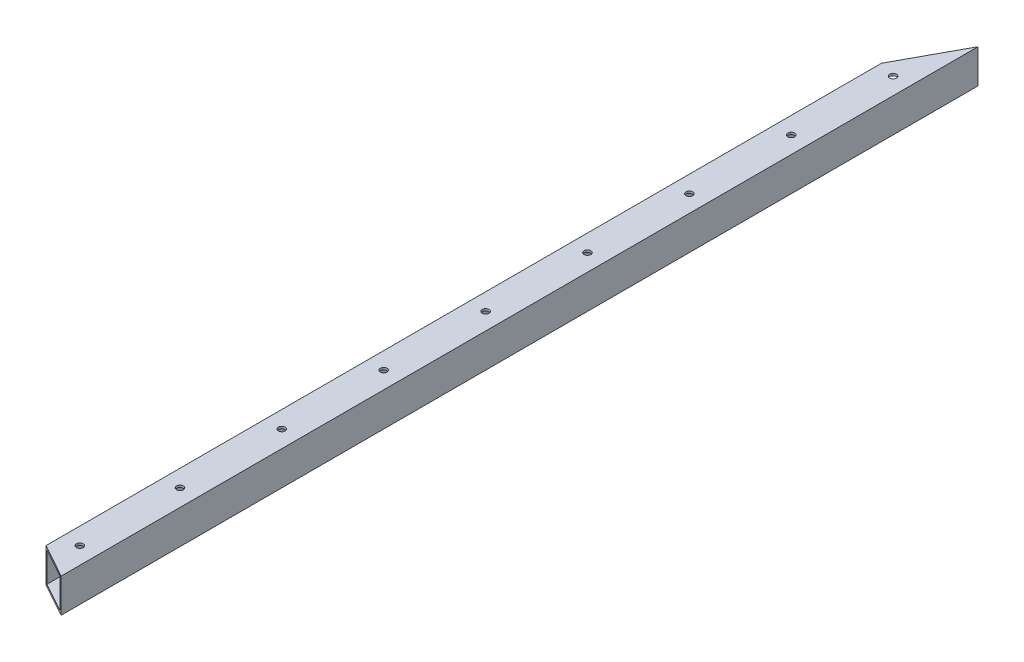
ISO-10303-21;
HEADER;
FILE_DESCRIPTION(('STEP AP214'),'2;1');
FILE_NAME('part.step','',(''),(''),'','','');
FILE_SCHEMA(('AUTOMOTIVE_DESIGN { 1 0 10303 214 1 1 1 1 }'));
ENDSEC;
DATA;
#1=APPLICATION_CONTEXT('core data for automotive mechanical design processes');
#2=APPLICATION_PROTOCOL_DEFINITION('international standard','automotive_design',2000,#1);
#3=PRODUCT_CONTEXT('',#1,'mechanical');
#4=PRODUCT('Part','Part','',(#3));
#5=PRODUCT_RELATED_PRODUCT_CATEGORY('part','',(#4));
#6=PRODUCT_DEFINITION_FORMATION('','',#4);
#7=PRODUCT_DEFINITION_CONTEXT('part definition',#1,'design');
#8=PRODUCT_DEFINITION('design','',#6,#7);
#9=PRODUCT_DEFINITION_SHAPE('','',#8);
#10=(LENGTH_UNIT() NAMED_UNIT(*) SI_UNIT(.MILLI.,.METRE.));
#11=(NAMED_UNIT(*) PLANE_ANGLE_UNIT() SI_UNIT($,.RADIAN.));
#12=(NAMED_UNIT(*) SI_UNIT($,.STERADIAN.) SOLID_ANGLE_UNIT());
#13=UNCERTAINTY_MEASURE_WITH_UNIT(LENGTH_MEASURE(1.E-05),#10,'distance_accuracy_value','');
#14=(GEOMETRIC_REPRESENTATION_CONTEXT(3) GLOBAL_UNCERTAINTY_ASSIGNED_CONTEXT((#13)) GLOBAL_UNIT_ASSIGNED_CONTEXT((#10,
#11,#12)) REPRESENTATION_CONTEXT('',''));
#15=CARTESIAN_POINT('',(0.,0.,0.));
#16=DIRECTION('',(0.,0.,1.));
#17=DIRECTION('',(1.,0.,0.));
#18=AXIS2_PLACEMENT_3D('',#15,#16,#17);
#19=CARTESIAN_POINT('',(1.5875,23.8125,685.8));
#20=DIRECTION('',(0.,-1.,0.));
#21=DIRECTION('',(0.,0.,-1.));
#22=AXIS2_PLACEMENT_3D('',#19,#20,#21);
#23=PLANE('',#22);
#24=CARTESIAN_POINT('',(12.7,23.8125,431.8));
#25=DIRECTION('',(0.,-1.,0.));
#26=DIRECTION('',(0.,0.,-1.));
#27=AXIS2_PLACEMENT_3D('',#24,#25,#26);
#28=CIRCLE('',#27,2.54);
#29=CARTESIAN_POINT('',(12.7,23.8125,429.26));
#30=VERTEX_POINT('',#29);
#31=EDGE_CURVE('E43',#30,#30,#28,.T.);
#32=ORIENTED_EDGE('',*,*,#31,.F.);
#33=EDGE_LOOP('',(#32));
#34=FACE_BOUND('',#33,.T.);
#35=CARTESIAN_POINT('',(12.7,23.8125,355.6));
#36=DIRECTION('',(0.,-1.,0.));
#37=DIRECTION('',(0.,0.,-1.));
#38=AXIS2_PLACEMENT_3D('',#35,#36,#37);
#39=CIRCLE('',#38,2.54);
#40=CARTESIAN_POINT('',(12.7,23.8125,353.06));
#41=VERTEX_POINT('',#40);
#42=EDGE_CURVE('E174',#41,#41,#39,.T.);
#43=ORIENTED_EDGE('',*,*,#42,.F.);
#44=EDGE_LOOP('',(#43));
#45=FACE_BOUND('',#44,.T.);
#46=CARTESIAN_POINT('',(12.7,23.8125,279.4));
#47=DIRECTION('',(0.,-1.,0.));
#48=DIRECTION('',(0.,0.,-1.));
#49=AXIS2_PLACEMENT_3D('',#46,#47,#48);
#50=CIRCLE('',#49,2.54);
#51=CARTESIAN_POINT('',(12.7,23.8125,276.86));
#52=VERTEX_POINT('',#51);
#53=EDGE_CURVE('E170',#52,#52,#50,.T.);
#54=ORIENTED_EDGE('',*,*,#53,.F.);
#55=EDGE_LOOP('',(#54));
#56=FACE_BOUND('',#55,.T.);
#57=CARTESIAN_POINT('',(12.7,23.8125,203.2));
#58=DIRECTION('',(0.,-1.,0.));
#59=DIRECTION('',(0.,0.,-1.));
#60=AXIS2_PLACEMENT_3D('',#57,#58,#59);
#61=CIRCLE('',#60,2.54);
#62=CARTESIAN_POINT('',(12.7,23.8125,200.66));
#63=VERTEX_POINT('',#62);
#64=EDGE_CURVE('E165',#63,#63,#61,.T.);
#65=ORIENTED_EDGE('',*,*,#64,.F.);
#66=EDGE_LOOP('',(#65));
#67=FACE_BOUND('',#66,.T.);
#68=CARTESIAN_POINT('',(12.7,23.8125,50.8));
#69=DIRECTION('',(0.,-1.,0.));
#70=DIRECTION('',(0.,0.,-1.));
#71=AXIS2_PLACEMENT_3D('',#68,#69,#70);
#72=CIRCLE('',#71,2.54);
#73=CARTESIAN_POINT('',(12.7,23.8125,48.26));
#74=VERTEX_POINT('',#73);
#75=EDGE_CURVE('E160',#74,#74,#72,.T.);
#76=ORIENTED_EDGE('',*,*,#75,.F.);
#77=EDGE_LOOP('',(#76));
#78=FACE_BOUND('',#77,.T.);
#79=CARTESIAN_POINT('',(12.7,23.8125,127.));
#80=DIRECTION('',(0.,-1.,0.));
#81=DIRECTION('',(0.,0.,-1.));
#82=AXIS2_PLACEMENT_3D('',#79,#80,#81);
#83=CIRCLE('',#82,2.54);
#84=CARTESIAN_POINT('',(12.7,23.8125,124.46));
#85=VERTEX_POINT('',#84);
#86=EDGE_CURVE('E154',#85,#85,#83,.T.);
#87=ORIENTED_EDGE('',*,*,#86,.F.);
#88=EDGE_LOOP('',(#87));
#89=FACE_BOUND('',#88,.T.);
#90=DIRECTION('',(-0.477158760259603,0.,0.878817112661968));
#91=VECTOR('',#90,1.);
#92=CARTESIAN_POINT('',(-267.601779237836,23.8125,539.642146556257));
#93=LINE('',#92,#91);
#94=CARTESIAN_POINT('',(23.8125,23.8125,2.9238112815782));
#95=VERTEX_POINT('',#94);
#96=CARTESIAN_POINT('',(1.58749999999996,23.8125,43.8571692236724));
#97=VERTEX_POINT('',#96);
#98=EDGE_CURVE('E11',#95,#97,#93,.T.);
#99=ORIENTED_EDGE('',*,*,#98,.F.);
#100=DIRECTION('',(0.,0.,-1.));
#101=VECTOR('',#100,1.);
#102=CARTESIAN_POINT('',(23.8125,23.8125,685.8));
#103=LINE('',#102,#101);
#104=CARTESIAN_POINT('',(23.8125,23.8125,684.920034380819));
#105=VERTEX_POINT('',#104);
#106=EDGE_CURVE('E199',#105,#95,#103,.T.);
#107=ORIENTED_EDGE('',*,*,#106,.F.);
#108=DIRECTION('',(0.874619707139394,0.,0.484809620246341));
#109=VECTOR('',#108,1.);
#110=CARTESIAN_POINT('',(7.18439876022348,23.8125,675.702927355137));
#111=LINE('',#110,#109);
#112=CARTESIAN_POINT('',(1.58749999999999,23.8125,672.600515712281));
#113=VERTEX_POINT('',#112);
#114=EDGE_CURVE('E49',#113,#105,#111,.T.);
#115=ORIENTED_EDGE('',*,*,#114,.F.);
#116=DIRECTION('',(0.,0.,-1.));
#117=VECTOR('',#116,1.);
#118=CARTESIAN_POINT('',(1.5875,23.8125,685.8));
#119=LINE('',#118,#117);
#120=EDGE_CURVE('E195',#113,#97,#119,.T.);
#121=ORIENTED_EDGE('',*,*,#120,.T.);
#122=EDGE_LOOP('',(#99,#107,#115,#121));
#123=FACE_BOUND('',#122,.T.);
#124=CARTESIAN_POINT('',(12.7,23.8125,508.));
#125=DIRECTION('',(0.,-1.,0.));
#126=DIRECTION('',(0.,0.,-1.));
#127=AXIS2_PLACEMENT_3D('',#124,#125,#126);
#128=CIRCLE('',#127,2.53999999999999);
#129=CARTESIAN_POINT('',(12.7,23.8125,505.46));
#130=VERTEX_POINT('',#129);
#131=EDGE_CURVE('E149',#130,#130,#128,.T.);
#132=ORIENTED_EDGE('',*,*,#131,.F.);
#133=EDGE_LOOP('',(#132));
#134=FACE_BOUND('',#133,.T.);
#135=CARTESIAN_POINT('',(12.7,23.8125,584.2));
#136=DIRECTION('',(0.,-1.,0.));
#137=DIRECTION('',(0.,0.,-1.));
#138=AXIS2_PLACEMENT_3D('',#135,#136,#137);
#139=CIRCLE('',#138,2.53999999999999);
#140=CARTESIAN_POINT('',(12.7,23.8125,581.66));
#141=VERTEX_POINT('',#140);
#142=EDGE_CURVE('E144',#141,#141,#139,.T.);
#143=ORIENTED_EDGE('',*,*,#142,.F.);
#144=EDGE_LOOP('',(#143));
#145=FACE_BOUND('',#144,.T.);
#146=CARTESIAN_POINT('',(12.7,23.8125,659.13));
#147=DIRECTION('',(0.,-1.,0.));
#148=DIRECTION('',(0.,0.,-1.));
#149=AXIS2_PLACEMENT_3D('',#146,#147,#148);
#150=CIRCLE('',#149,2.53999999999994);
#151=CARTESIAN_POINT('',(12.7,23.8125,656.59));
#152=VERTEX_POINT('',#151);
#153=EDGE_CURVE('E138',#152,#152,#150,.T.);
#154=ORIENTED_EDGE('',*,*,#153,.F.);
#155=EDGE_LOOP('',(#154));
#156=FACE_BOUND('',#155,.T.);
#157=ADVANCED_FACE('F39',(#34,#45,#56,#67,#78,#89,#123,#134,#145,#156),#23,.T.);
#158=CARTESIAN_POINT('',(23.8125,1.5875,685.8));
#159=DIRECTION('',(-1.,0.,0.));
#160=DIRECTION('',(0.,0.,1.));
#161=AXIS2_PLACEMENT_3D('',#158,#159,#160);
#162=PLANE('',#161);
#163=DIRECTION('',(0.,1.,0.));
#164=VECTOR('',#163,1.);
#165=CARTESIAN_POINT('',(23.8125,1.5875,2.92381128157815));
#166=LINE('',#165,#164);
#167=CARTESIAN_POINT('',(23.8125,1.5875,2.92381128157815));
#168=VERTEX_POINT('',#167);
#169=EDGE_CURVE('E278',#168,#95,#166,.T.);
#170=ORIENTED_EDGE('',*,*,#169,.F.);
#171=DIRECTION('',(0.,0.,-1.));
#172=VECTOR('',#171,1.);
#173=CARTESIAN_POINT('',(23.8125,1.5875,685.8));
#174=LINE('',#173,#172);
#175=CARTESIAN_POINT('',(23.8125,1.5875,684.920034380819));
#176=VERTEX_POINT('',#175);
#177=EDGE_CURVE('E203',#176,#168,#174,.T.);
#178=ORIENTED_EDGE('',*,*,#177,.F.);
#179=DIRECTION('',(0.,-1.,0.));
#180=VECTOR('',#179,1.);
#181=CARTESIAN_POINT('',(23.8125,1.5875,684.920034380819));
#182=LINE('',#181,#180);
#183=EDGE_CURVE('E270',#105,#176,#182,.T.);
#184=ORIENTED_EDGE('',*,*,#183,.F.);
#185=ORIENTED_EDGE('',*,*,#106,.T.);
#186=EDGE_LOOP('',(#170,#178,#184,#185));
#187=FACE_BOUND('',#186,.T.);
#188=ADVANCED_FACE('F299',(#187),#162,.T.);
#189=CARTESIAN_POINT('',(1.5875,1.5875,685.8));
#190=DIRECTION('',(0.,1.,0.));
#191=DIRECTION('',(0.,0.,1.));
#192=AXIS2_PLACEMENT_3D('',#189,#190,#191);
#193=PLANE('',#192);
#194=CARTESIAN_POINT('',(12.7,1.5875,431.8));
#195=DIRECTION('',(0.,1.,0.));
#196=DIRECTION('',(0.,0.,1.));
#197=AXIS2_PLACEMENT_3D('',#194,#195,#196);
#198=CIRCLE('',#197,2.54);
#199=CARTESIAN_POINT('',(12.7,1.5875,434.34));
#200=VERTEX_POINT('',#199);
#201=EDGE_CURVE('E191',#200,#200,#198,.T.);
#202=ORIENTED_EDGE('',*,*,#201,.F.);
#203=EDGE_LOOP('',(#202));
#204=FACE_BOUND('',#203,.T.);
#205=CARTESIAN_POINT('',(12.7,1.5875,355.6));
#206=DIRECTION('',(0.,1.,0.));
#207=DIRECTION('',(0.,0.,1.));
#208=AXIS2_PLACEMENT_3D('',#205,#206,#207);
#209=CIRCLE('',#208,2.54);
#210=CARTESIAN_POINT('',(12.7,1.5875,358.14));
#211=VERTEX_POINT('',#210);
#212=EDGE_CURVE('E177',#211,#211,#209,.T.);
#213=ORIENTED_EDGE('',*,*,#212,.F.);
#214=EDGE_LOOP('',(#213));
#215=FACE_BOUND('',#214,.T.);
#216=CARTESIAN_POINT('',(12.7,1.5875,279.4));
#217=DIRECTION('',(0.,1.,0.));
#218=DIRECTION('',(0.,0.,1.));
#219=AXIS2_PLACEMENT_3D('',#216,#217,#218);
#220=CIRCLE('',#219,2.54);
#221=CARTESIAN_POINT('',(12.7,1.5875,281.94));
#222=VERTEX_POINT('',#221);
#223=EDGE_CURVE('E173',#222,#222,#220,.T.);
#224=ORIENTED_EDGE('',*,*,#223,.F.);
#225=EDGE_LOOP('',(#224));
#226=FACE_BOUND('',#225,.T.);
#227=CARTESIAN_POINT('',(12.7,1.5875,203.2));
#228=DIRECTION('',(0.,1.,0.));
#229=DIRECTION('',(0.,0.,1.));
#230=AXIS2_PLACEMENT_3D('',#227,#228,#229);
#231=CIRCLE('',#230,2.54);
#232=CARTESIAN_POINT('',(12.7,1.5875,205.74));
#233=VERTEX_POINT('',#232);
#234=EDGE_CURVE('E169',#233,#233,#231,.T.);
#235=ORIENTED_EDGE('',*,*,#234,.F.);
#236=EDGE_LOOP('',(#235));
#237=FACE_BOUND('',#236,.T.);
#238=CARTESIAN_POINT('',(12.7,1.5875,50.8));
#239=DIRECTION('',(0.,1.,0.));
#240=DIRECTION('',(0.,0.,1.));
#241=AXIS2_PLACEMENT_3D('',#238,#239,#240);
#242=CIRCLE('',#241,2.54);
#243=CARTESIAN_POINT('',(12.7,1.5875,53.34));
#244=VERTEX_POINT('',#243);
#245=EDGE_CURVE('E164',#244,#244,#242,.T.);
#246=ORIENTED_EDGE('',*,*,#245,.F.);
#247=EDGE_LOOP('',(#246));
#248=FACE_BOUND('',#247,.T.);
#249=CARTESIAN_POINT('',(12.7,1.5875,127.));
#250=DIRECTION('',(0.,1.,0.));
#251=DIRECTION('',(0.,0.,1.));
#252=AXIS2_PLACEMENT_3D('',#249,#250,#251);
#253=CIRCLE('',#252,2.54);
#254=CARTESIAN_POINT('',(12.7,1.5875,129.54));
#255=VERTEX_POINT('',#254);
#256=EDGE_CURVE('E158',#255,#255,#253,.T.);
#257=ORIENTED_EDGE('',*,*,#256,.F.);
#258=EDGE_LOOP('',(#257));
#259=FACE_BOUND('',#258,.T.);
#260=DIRECTION('',(0.477158760259603,0.,-0.878817112661968));
#261=VECTOR('',#260,1.);
#262=CARTESIAN_POINT('',(-267.601779237836,1.5875,539.642146556257));
#263=LINE('',#262,#261);
#264=CARTESIAN_POINT('',(1.58749999999996,1.5875,43.8571692236724));
#265=VERTEX_POINT('',#264);
#266=EDGE_CURVE('E281',#265,#168,#263,.T.);
#267=ORIENTED_EDGE('',*,*,#266,.F.);
#268=DIRECTION('',(0.,0.,-1.));
#269=VECTOR('',#268,1.);
#270=CARTESIAN_POINT('',(1.5875,1.5875,685.8));
#271=LINE('',#270,#269);
#272=CARTESIAN_POINT('',(1.5875,1.5875,672.600515712281));
#273=VERTEX_POINT('',#272);
#274=EDGE_CURVE('E207',#273,#265,#271,.T.);
#275=ORIENTED_EDGE('',*,*,#274,.F.);
#276=DIRECTION('',(-0.874619707139394,0.,-0.484809620246341));
#277=VECTOR('',#276,1.);
#278=CARTESIAN_POINT('',(7.18439876022348,1.5875,675.702927355137));
#279=LINE('',#278,#277);
#280=EDGE_CURVE('E273',#176,#273,#279,.T.);
#281=ORIENTED_EDGE('',*,*,#280,.F.);
#282=ORIENTED_EDGE('',*,*,#177,.T.);
#283=EDGE_LOOP('',(#267,#275,#281,#282));
#284=FACE_BOUND('',#283,.T.);
#285=CARTESIAN_POINT('',(12.7,1.5875,508.));
#286=DIRECTION('',(0.,1.,0.));
#287=DIRECTION('',(0.,0.,1.));
#288=AXIS2_PLACEMENT_3D('',#285,#286,#287);
#289=CIRCLE('',#288,2.53999999999999);
#290=CARTESIAN_POINT('',(12.7,1.5875,510.54));
#291=VERTEX_POINT('',#290);
#292=EDGE_CURVE('E152',#291,#291,#289,.T.);
#293=ORIENTED_EDGE('',*,*,#292,.F.);
#294=EDGE_LOOP('',(#293));
#295=FACE_BOUND('',#294,.T.);
#296=CARTESIAN_POINT('',(12.7,1.5875,584.2));
#297=DIRECTION('',(0.,1.,0.));
#298=DIRECTION('',(0.,0.,1.));
#299=AXIS2_PLACEMENT_3D('',#296,#297,#298);
#300=CIRCLE('',#299,2.53999999999999);
#301=CARTESIAN_POINT('',(12.7,1.5875,586.74));
#302=VERTEX_POINT('',#301);
#303=EDGE_CURVE('E148',#302,#302,#300,.T.);
#304=ORIENTED_EDGE('',*,*,#303,.F.);
#305=EDGE_LOOP('',(#304));
#306=FACE_BOUND('',#305,.T.);
#307=CARTESIAN_POINT('',(12.7,1.5875,659.13));
#308=DIRECTION('',(0.,1.,0.));
#309=DIRECTION('',(0.,0.,1.));
#310=AXIS2_PLACEMENT_3D('',#307,#308,#309);
#311=CIRCLE('',#310,2.53999999999994);
#312=CARTESIAN_POINT('',(12.7,1.5875,661.67));
#313=VERTEX_POINT('',#312);
#314=EDGE_CURVE('E142',#313,#313,#311,.T.);
#315=ORIENTED_EDGE('',*,*,#314,.F.);
#316=EDGE_LOOP('',(#315));
#317=FACE_BOUND('',#316,.T.);
#318=ADVANCED_FACE('F295',(#204,#215,#226,#237,#248,#259,#284,#295,#306,#317),#193,.T.);
#319=CARTESIAN_POINT('',(1.5875,1.5875,685.8));
#320=DIRECTION('',(1.,0.,0.));
#321=DIRECTION('',(0.,0.,-1.));
#322=AXIS2_PLACEMENT_3D('',#319,#320,#321);
#323=PLANE('',#322);
#324=DIRECTION('',(0.,-1.,0.));
#325=VECTOR('',#324,1.);
#326=CARTESIAN_POINT('',(1.5875,1.5875,43.8571692236723));
#327=LINE('',#326,#325);
#328=EDGE_CURVE('E159',#97,#265,#327,.T.);
#329=ORIENTED_EDGE('',*,*,#328,.F.);
#330=ORIENTED_EDGE('',*,*,#120,.F.);
#331=DIRECTION('',(0.,1.,0.));
#332=VECTOR('',#331,1.);
#333=CARTESIAN_POINT('',(1.5875,1.5875,672.600515712281));
#334=LINE('',#333,#332);
#335=EDGE_CURVE('E65',#273,#113,#334,.T.);
#336=ORIENTED_EDGE('',*,*,#335,.F.);
#337=ORIENTED_EDGE('',*,*,#274,.T.);
#338=EDGE_LOOP('',(#329,#330,#336,#337));
#339=FACE_BOUND('',#338,.T.);
#340=ADVANCED_FACE('F298',(#339),#323,.T.);
#341=CARTESIAN_POINT('',(12.7,0.,659.13));
#342=DIRECTION('',(0.,1.,0.));
#343=DIRECTION('',(0.,0.,1.));
#344=AXIS2_PLACEMENT_3D('',#341,#342,#343);
#345=CYLINDRICAL_SURFACE('',#344,2.53999999999994);
#346=ORIENTED_EDGE('',*,*,#153,.T.);
#347=EDGE_LOOP('',(#346));
#348=FACE_BOUND('',#347,.T.);
#349=CARTESIAN_POINT('',(12.7,25.4,659.13));
#350=DIRECTION('',(0.,1.,0.));
#351=DIRECTION('',(0.,0.,1.));
#352=AXIS2_PLACEMENT_3D('',#349,#350,#351);
#353=CIRCLE('',#352,2.53999999999994);
#354=CARTESIAN_POINT('',(12.7,25.4,661.67));
#355=VERTEX_POINT('',#354);
#356=EDGE_CURVE('E243',#355,#355,#353,.T.);
#357=ORIENTED_EDGE('',*,*,#356,.T.);
#358=EDGE_LOOP('',(#357));
#359=FACE_BOUND('',#358,.T.);
#360=ADVANCED_FACE('F319',(#348,#359),#345,.F.);
#361=CARTESIAN_POINT('',(12.7,0.,584.2));
#362=DIRECTION('',(0.,1.,0.));
#363=DIRECTION('',(0.,0.,1.));
#364=AXIS2_PLACEMENT_3D('',#361,#362,#363);
#365=CYLINDRICAL_SURFACE('',#364,2.53999999999999);
#366=ORIENTED_EDGE('',*,*,#142,.T.);
#367=EDGE_LOOP('',(#366));
#368=FACE_BOUND('',#367,.T.);
#369=CARTESIAN_POINT('',(12.7,25.4,584.2));
#370=DIRECTION('',(0.,1.,0.));
#371=DIRECTION('',(0.,0.,1.));
#372=AXIS2_PLACEMENT_3D('',#369,#370,#371);
#373=CIRCLE('',#372,2.53999999999999);
#374=CARTESIAN_POINT('',(12.7,25.4,586.74));
#375=VERTEX_POINT('',#374);
#376=EDGE_CURVE('E378',#375,#375,#373,.T.);
#377=ORIENTED_EDGE('',*,*,#376,.T.);
#378=EDGE_LOOP('',(#377));
#379=FACE_BOUND('',#378,.T.);
#380=ADVANCED_FACE('F382',(#368,#379),#365,.F.);
#381=CARTESIAN_POINT('',(12.7,0.,508.));
#382=DIRECTION('',(0.,1.,0.));
#383=DIRECTION('',(0.,0.,1.));
#384=AXIS2_PLACEMENT_3D('',#381,#382,#383);
#385=CYLINDRICAL_SURFACE('',#384,2.53999999999999);
#386=ORIENTED_EDGE('',*,*,#131,.T.);
#387=EDGE_LOOP('',(#386));
#388=FACE_BOUND('',#387,.T.);
#389=CARTESIAN_POINT('',(12.7,25.4,508.));
#390=DIRECTION('',(0.,1.,0.));
#391=DIRECTION('',(0.,0.,1.));
#392=AXIS2_PLACEMENT_3D('',#389,#390,#391);
#393=CIRCLE('',#392,2.53999999999999);
#394=CARTESIAN_POINT('',(12.7,25.4,510.54));
#395=VERTEX_POINT('',#394);
#396=EDGE_CURVE('E374',#395,#395,#393,.T.);
#397=ORIENTED_EDGE('',*,*,#396,.T.);
#398=EDGE_LOOP('',(#397));
#399=FACE_BOUND('',#398,.T.);
#400=ADVANCED_FACE('F387',(#388,#399),#385,.F.);
#401=CARTESIAN_POINT('',(0.,0.,671.7205500931));
#402=DIRECTION('',(0.484809620246341,0.,-0.874619707139394));
#403=DIRECTION('',(-0.874619707139394,0.,-0.484809620246341));
#404=AXIS2_PLACEMENT_3D('',#401,#402,#403);
#405=PLANE('',#404);
#406=ORIENTED_EDGE('',*,*,#335,.T.);
#407=ORIENTED_EDGE('',*,*,#114,.T.);
#408=ORIENTED_EDGE('',*,*,#183,.T.);
#409=ORIENTED_EDGE('',*,*,#280,.T.);
#410=EDGE_LOOP('',(#406,#407,#408,#409));
#411=FACE_BOUND('',#410,.T.);
#412=DIRECTION('',(-0.874619707139394,0.,-0.484809620246341));
#413=VECTOR('',#412,1.);
#414=CARTESIAN_POINT('',(0.,25.4,671.7205500931));
#415=LINE('',#414,#413);
#416=CARTESIAN_POINT('',(25.4,25.4,685.8));
#417=VERTEX_POINT('',#416);
#418=CARTESIAN_POINT('',(0.,25.4,671.7205500931));
#419=VERTEX_POINT('',#418);
#420=EDGE_CURVE('E223',#417,#419,#415,.T.);
#421=ORIENTED_EDGE('',*,*,#420,.T.);
#422=DIRECTION('',(0.,1.,0.));
#423=VECTOR('',#422,1.);
#424=CARTESIAN_POINT('',(0.,0.,671.7205500931));
#425=LINE('',#424,#423);
#426=CARTESIAN_POINT('',(0.,0.,671.7205500931));
#427=VERTEX_POINT('',#426);
#428=EDGE_CURVE('E229',#427,#419,#425,.T.);
#429=ORIENTED_EDGE('',*,*,#428,.F.);
#430=DIRECTION('',(-0.874619707139394,0.,-0.484809620246341));
#431=VECTOR('',#430,1.);
#432=CARTESIAN_POINT('',(0.,0.,671.7205500931));
#433=LINE('',#432,#431);
#434=CARTESIAN_POINT('',(25.4,0.,685.8));
#435=VERTEX_POINT('',#434);
#436=EDGE_CURVE('E127',#435,#427,#433,.T.);
#437=ORIENTED_EDGE('',*,*,#436,.F.);
#438=DIRECTION('',(0.,1.,0.));
#439=VECTOR('',#438,1.);
#440=CARTESIAN_POINT('',(25.4,0.,685.8));
#441=LINE('',#440,#439);
#442=EDGE_CURVE('E211',#435,#417,#441,.T.);
#443=ORIENTED_EDGE('',*,*,#442,.T.);
#444=EDGE_LOOP('',(#421,#429,#437,#443));
#445=FACE_BOUND('',#444,.T.);
#446=ADVANCED_FACE('F228',(#411,#445),#405,.F.);
#447=CARTESIAN_POINT('',(0.,0.,46.7809805052505));
#448=DIRECTION('',(0.878817112661968,0.,0.477158760259603));
#449=DIRECTION('',(0.477158760259603,0.,-0.878817112661968));
#450=AXIS2_PLACEMENT_3D('',#447,#448,#449);
#451=PLANE('',#450);
#452=ORIENTED_EDGE('',*,*,#328,.T.);
#453=ORIENTED_EDGE('',*,*,#266,.T.);
#454=ORIENTED_EDGE('',*,*,#169,.T.);
#455=ORIENTED_EDGE('',*,*,#98,.T.);
#456=EDGE_LOOP('',(#452,#453,#454,#455));
#457=FACE_BOUND('',#456,.T.);
#458=DIRECTION('',(0.477158760259603,0.,-0.878817112661968));
#459=VECTOR('',#458,1.);
#460=CARTESIAN_POINT('',(0.,25.4,46.7809805052505));
#461=LINE('',#460,#459);
#462=CARTESIAN_POINT('',(0.,25.4,46.7809805052505));
#463=VERTEX_POINT('',#462);
#464=CARTESIAN_POINT('',(25.4,25.4,0.));
#465=VERTEX_POINT('',#464);
#466=EDGE_CURVE('E113',#463,#465,#461,.T.);
#467=ORIENTED_EDGE('',*,*,#466,.T.);
#468=DIRECTION('',(0.,1.,0.));
#469=VECTOR('',#468,1.);
#470=CARTESIAN_POINT('',(25.4,0.,0.));
#471=LINE('',#470,#469);
#472=CARTESIAN_POINT('',(25.4,0.,0.));
#473=VERTEX_POINT('',#472);
#474=EDGE_CURVE('E107',#473,#465,#471,.T.);
#475=ORIENTED_EDGE('',*,*,#474,.F.);
#476=DIRECTION('',(0.477158760259603,0.,-0.878817112661968));
#477=VECTOR('',#476,1.);
#478=CARTESIAN_POINT('',(0.,0.,46.7809805052505));
#479=LINE('',#478,#477);
#480=CARTESIAN_POINT('',(0.,0.,46.7809805052505));
#481=VERTEX_POINT('',#480);
#482=EDGE_CURVE('E104',#481,#473,#479,.T.);
#483=ORIENTED_EDGE('',*,*,#482,.F.);
#484=DIRECTION('',(0.,1.,0.));
#485=VECTOR('',#484,1.);
#486=CARTESIAN_POINT('',(0.,0.,46.7809805052505));
#487=LINE('',#486,#485);
#488=EDGE_CURVE('E57',#481,#463,#487,.T.);
#489=ORIENTED_EDGE('',*,*,#488,.T.);
#490=EDGE_LOOP('',(#467,#475,#483,#489));
#491=FACE_BOUND('',#490,.T.);
#492=ADVANCED_FACE('F105',(#457,#491),#451,.F.);
#493=CARTESIAN_POINT('',(12.7,0.,127.));
#494=DIRECTION('',(0.,1.,0.));
#495=DIRECTION('',(0.,0.,1.));
#496=AXIS2_PLACEMENT_3D('',#493,#494,#495);
#497=CYLINDRICAL_SURFACE('',#496,2.54);
#498=ORIENTED_EDGE('',*,*,#86,.T.);
#499=EDGE_LOOP('',(#498));
#500=FACE_BOUND('',#499,.T.);
#501=CARTESIAN_POINT('',(12.7,25.4,127.));
#502=DIRECTION('',(0.,1.,0.));
#503=DIRECTION('',(0.,0.,1.));
#504=AXIS2_PLACEMENT_3D('',#501,#502,#503);
#505=CIRCLE('',#504,2.54);
#506=CARTESIAN_POINT('',(12.7,25.4,129.54));
#507=VERTEX_POINT('',#506);
#508=EDGE_CURVE('E123',#507,#507,#505,.T.);
#509=ORIENTED_EDGE('',*,*,#508,.T.);
#510=EDGE_LOOP('',(#509));
#511=FACE_BOUND('',#510,.T.);
#512=ADVANCED_FACE('F492',(#500,#511),#497,.F.);
#513=CARTESIAN_POINT('',(12.7,0.,50.8));
#514=DIRECTION('',(0.,1.,0.));
#515=DIRECTION('',(0.,0.,1.));
#516=AXIS2_PLACEMENT_3D('',#513,#514,#515);
#517=CYLINDRICAL_SURFACE('',#516,2.54);
#518=ORIENTED_EDGE('',*,*,#75,.T.);
#519=EDGE_LOOP('',(#518));
#520=FACE_BOUND('',#519,.T.);
#521=CARTESIAN_POINT('',(12.7,25.4,50.8));
#522=DIRECTION('',(0.,1.,0.));
#523=DIRECTION('',(0.,0.,1.));
#524=AXIS2_PLACEMENT_3D('',#521,#522,#523);
#525=CIRCLE('',#524,2.54);
#526=CARTESIAN_POINT('',(12.7,25.4,53.34));
#527=VERTEX_POINT('',#526);
#528=EDGE_CURVE('E244',#527,#527,#525,.T.);
#529=ORIENTED_EDGE('',*,*,#528,.T.);
#530=EDGE_LOOP('',(#529));
#531=FACE_BOUND('',#530,.T.);
#532=ADVANCED_FACE('F497',(#520,#531),#517,.F.);
#533=CARTESIAN_POINT('',(12.7,0.,203.2));
#534=DIRECTION('',(0.,1.,0.));
#535=DIRECTION('',(0.,0.,1.));
#536=AXIS2_PLACEMENT_3D('',#533,#534,#535);
#537=CYLINDRICAL_SURFACE('',#536,2.54);
#538=ORIENTED_EDGE('',*,*,#64,.T.);
#539=EDGE_LOOP('',(#538));
#540=FACE_BOUND('',#539,.T.);
#541=CARTESIAN_POINT('',(12.7,25.4,203.2));
#542=DIRECTION('',(0.,1.,0.));
#543=DIRECTION('',(0.,0.,1.));
#544=AXIS2_PLACEMENT_3D('',#541,#542,#543);
#545=CIRCLE('',#544,2.54);
#546=CARTESIAN_POINT('',(12.7,25.4,205.74));
#547=VERTEX_POINT('',#546);
#548=EDGE_CURVE('E366',#547,#547,#545,.T.);
#549=ORIENTED_EDGE('',*,*,#548,.T.);
#550=EDGE_LOOP('',(#549));
#551=FACE_BOUND('',#550,.T.);
#552=ADVANCED_FACE('F482',(#540,#551),#537,.F.);
#553=CARTESIAN_POINT('',(12.7,0.,279.4));
#554=DIRECTION('',(0.,1.,0.));
#555=DIRECTION('',(0.,0.,1.));
#556=AXIS2_PLACEMENT_3D('',#553,#554,#555);
#557=CYLINDRICAL_SURFACE('',#556,2.54);
#558=ORIENTED_EDGE('',*,*,#53,.T.);
#559=EDGE_LOOP('',(#558));
#560=FACE_BOUND('',#559,.T.);
#561=CARTESIAN_POINT('',(12.7,25.4,279.4));
#562=DIRECTION('',(0.,1.,0.));
#563=DIRECTION('',(0.,0.,1.));
#564=AXIS2_PLACEMENT_3D('',#561,#562,#563);
#565=CIRCLE('',#564,2.54);
#566=CARTESIAN_POINT('',(12.7,25.4,281.94));
#567=VERTEX_POINT('',#566);
#568=EDGE_CURVE('E362',#567,#567,#565,.T.);
#569=ORIENTED_EDGE('',*,*,#568,.T.);
#570=EDGE_LOOP('',(#569));
#571=FACE_BOUND('',#570,.T.);
#572=ADVANCED_FACE('F456',(#560,#571),#557,.F.);
#573=CARTESIAN_POINT('',(12.7,0.,355.6));
#574=DIRECTION('',(0.,1.,0.));
#575=DIRECTION('',(0.,0.,1.));
#576=AXIS2_PLACEMENT_3D('',#573,#574,#575);
#577=CYLINDRICAL_SURFACE('',#576,2.54);
#578=ORIENTED_EDGE('',*,*,#42,.T.);
#579=EDGE_LOOP('',(#578));
#580=FACE_BOUND('',#579,.T.);
#581=CARTESIAN_POINT('',(12.7,25.4,355.6));
#582=DIRECTION('',(0.,1.,0.));
#583=DIRECTION('',(0.,0.,1.));
#584=AXIS2_PLACEMENT_3D('',#581,#582,#583);
#585=CIRCLE('',#584,2.54);
#586=CARTESIAN_POINT('',(12.7,25.4,358.14));
#587=VERTEX_POINT('',#586);
#588=EDGE_CURVE('E358',#587,#587,#585,.T.);
#589=ORIENTED_EDGE('',*,*,#588,.T.);
#590=EDGE_LOOP('',(#589));
#591=FACE_BOUND('',#590,.T.);
#592=ADVANCED_FACE('F450',(#580,#591),#577,.F.);
#593=CARTESIAN_POINT('',(12.7,0.,431.8));
#594=DIRECTION('',(0.,1.,0.));
#595=DIRECTION('',(0.,0.,1.));
#596=AXIS2_PLACEMENT_3D('',#593,#594,#595);
#597=CYLINDRICAL_SURFACE('',#596,2.54);
#598=ORIENTED_EDGE('',*,*,#31,.T.);
#599=EDGE_LOOP('',(#598));
#600=FACE_BOUND('',#599,.T.);
#601=CARTESIAN_POINT('',(12.7,25.4,431.8));
#602=DIRECTION('',(0.,1.,0.));
#603=DIRECTION('',(0.,0.,1.));
#604=AXIS2_PLACEMENT_3D('',#601,#602,#603);
#605=CIRCLE('',#604,2.54);
#606=CARTESIAN_POINT('',(12.7,25.4,434.34));
#607=VERTEX_POINT('',#606);
#608=EDGE_CURVE('E354',#607,#607,#605,.T.);
#609=ORIENTED_EDGE('',*,*,#608,.T.);
#610=EDGE_LOOP('',(#609));
#611=FACE_BOUND('',#610,.T.);
#612=ADVANCED_FACE('F317',(#600,#611),#597,.F.);
#613=ORIENTED_EDGE('',*,*,#314,.T.);
#614=EDGE_LOOP('',(#613));
#615=FACE_BOUND('',#614,.T.);
#616=CARTESIAN_POINT('',(12.7,0.,659.13));
#617=DIRECTION('',(0.,1.,0.));
#618=DIRECTION('',(0.,0.,1.));
#619=AXIS2_PLACEMENT_3D('',#616,#617,#618);
#620=CIRCLE('',#619,2.53999999999994);
#621=CARTESIAN_POINT('',(12.7,0.,661.67));
#622=VERTEX_POINT('',#621);
#623=EDGE_CURVE('E143',#622,#622,#620,.T.);
#624=ORIENTED_EDGE('',*,*,#623,.F.);
#625=EDGE_LOOP('',(#624));
#626=FACE_BOUND('',#625,.T.);
#627=ADVANCED_FACE('F313',(#615,#626),#345,.F.);
#628=ORIENTED_EDGE('',*,*,#303,.T.);
#629=EDGE_LOOP('',(#628));
#630=FACE_BOUND('',#629,.T.);
#631=CARTESIAN_POINT('',(12.7,0.,584.2));
#632=DIRECTION('',(0.,1.,0.));
#633=DIRECTION('',(0.,0.,1.));
#634=AXIS2_PLACEMENT_3D('',#631,#632,#633);
#635=CIRCLE('',#634,2.53999999999999);
#636=CARTESIAN_POINT('',(12.7,0.,586.74));
#637=VERTEX_POINT('',#636);
#638=EDGE_CURVE('E410',#637,#637,#635,.T.);
#639=ORIENTED_EDGE('',*,*,#638,.F.);
#640=EDGE_LOOP('',(#639));
#641=FACE_BOUND('',#640,.T.);
#642=ADVANCED_FACE('F316',(#630,#641),#365,.F.);
#643=ORIENTED_EDGE('',*,*,#292,.T.);
#644=EDGE_LOOP('',(#643));
#645=FACE_BOUND('',#644,.T.);
#646=CARTESIAN_POINT('',(12.7,0.,508.));
#647=DIRECTION('',(0.,1.,0.));
#648=DIRECTION('',(0.,0.,1.));
#649=AXIS2_PLACEMENT_3D('',#646,#647,#648);
#650=CIRCLE('',#649,2.53999999999999);
#651=CARTESIAN_POINT('',(12.7,0.,510.54));
#652=VERTEX_POINT('',#651);
#653=EDGE_CURVE('E416',#652,#652,#650,.T.);
#654=ORIENTED_EDGE('',*,*,#653,.F.);
#655=EDGE_LOOP('',(#654));
#656=FACE_BOUND('',#655,.T.);
#657=ADVANCED_FACE('F397',(#645,#656),#385,.F.);
#658=ORIENTED_EDGE('',*,*,#256,.T.);
#659=EDGE_LOOP('',(#658));
#660=FACE_BOUND('',#659,.T.);
#661=CARTESIAN_POINT('',(12.7,0.,127.));
#662=DIRECTION('',(0.,1.,0.));
#663=DIRECTION('',(0.,0.,1.));
#664=AXIS2_PLACEMENT_3D('',#661,#662,#663);
#665=CIRCLE('',#664,2.54);
#666=CARTESIAN_POINT('',(12.7,0.,129.54));
#667=VERTEX_POINT('',#666);
#668=EDGE_CURVE('E248',#667,#667,#665,.T.);
#669=ORIENTED_EDGE('',*,*,#668,.F.);
#670=EDGE_LOOP('',(#669));
#671=FACE_BOUND('',#670,.T.);
#672=ADVANCED_FACE('F405',(#660,#671),#497,.F.);
#673=ORIENTED_EDGE('',*,*,#245,.T.);
#674=EDGE_LOOP('',(#673));
#675=FACE_BOUND('',#674,.T.);
#676=CARTESIAN_POINT('',(12.7,0.,50.8));
#677=DIRECTION('',(0.,1.,0.));
#678=DIRECTION('',(0.,0.,1.));
#679=AXIS2_PLACEMENT_3D('',#676,#677,#678);
#680=CIRCLE('',#679,2.54);
#681=CARTESIAN_POINT('',(12.7,0.,53.34));
#682=VERTEX_POINT('',#681);
#683=EDGE_CURVE('E239',#682,#682,#680,.T.);
#684=ORIENTED_EDGE('',*,*,#683,.F.);
#685=EDGE_LOOP('',(#684));
#686=FACE_BOUND('',#685,.T.);
#687=ADVANCED_FACE('F292',(#675,#686),#517,.F.);
#688=ORIENTED_EDGE('',*,*,#234,.T.);
#689=EDGE_LOOP('',(#688));
#690=FACE_BOUND('',#689,.T.);
#691=CARTESIAN_POINT('',(12.7,0.,203.2));
#692=DIRECTION('',(0.,1.,0.));
#693=DIRECTION('',(0.,0.,1.));
#694=AXIS2_PLACEMENT_3D('',#691,#692,#693);
#695=CIRCLE('',#694,2.54);
#696=CARTESIAN_POINT('',(12.7,0.,205.74));
#697=VERTEX_POINT('',#696);
#698=EDGE_CURVE('E235',#697,#697,#695,.T.);
#699=ORIENTED_EDGE('',*,*,#698,.F.);
#700=EDGE_LOOP('',(#699));
#701=FACE_BOUND('',#700,.T.);
#702=ADVANCED_FACE('F479',(#690,#701),#537,.F.);
#703=ORIENTED_EDGE('',*,*,#223,.T.);
#704=EDGE_LOOP('',(#703));
#705=FACE_BOUND('',#704,.T.);
#706=CARTESIAN_POINT('',(12.7,0.,279.4));
#707=DIRECTION('',(0.,1.,0.));
#708=DIRECTION('',(0.,0.,1.));
#709=AXIS2_PLACEMENT_3D('',#706,#707,#708);
#710=CIRCLE('',#709,2.54);
#711=CARTESIAN_POINT('',(12.7,0.,281.94));
#712=VERTEX_POINT('',#711);
#713=EDGE_CURVE('E426',#712,#712,#710,.T.);
#714=ORIENTED_EDGE('',*,*,#713,.F.);
#715=EDGE_LOOP('',(#714));
#716=FACE_BOUND('',#715,.T.);
#717=ADVANCED_FACE('F466',(#705,#716),#557,.F.);
#718=ORIENTED_EDGE('',*,*,#212,.T.);
#719=EDGE_LOOP('',(#718));
#720=FACE_BOUND('',#719,.T.);
#721=CARTESIAN_POINT('',(12.7,0.,355.6));
#722=DIRECTION('',(0.,1.,0.));
#723=DIRECTION('',(0.,0.,1.));
#724=AXIS2_PLACEMENT_3D('',#721,#722,#723);
#725=CIRCLE('',#724,2.54);
#726=CARTESIAN_POINT('',(12.7,0.,358.14));
#727=VERTEX_POINT('',#726);
#728=EDGE_CURVE('E432',#727,#727,#725,.T.);
#729=ORIENTED_EDGE('',*,*,#728,.F.);
#730=EDGE_LOOP('',(#729));
#731=FACE_BOUND('',#730,.T.);
#732=ADVANCED_FACE('F458',(#720,#731),#577,.F.);
#733=ORIENTED_EDGE('',*,*,#201,.T.);
#734=EDGE_LOOP('',(#733));
#735=FACE_BOUND('',#734,.T.);
#736=CARTESIAN_POINT('',(12.7,0.,431.8));
#737=DIRECTION('',(0.,1.,0.));
#738=DIRECTION('',(0.,0.,1.));
#739=AXIS2_PLACEMENT_3D('',#736,#737,#738);
#740=CIRCLE('',#739,2.54);
#741=CARTESIAN_POINT('',(12.7,0.,434.34));
#742=VERTEX_POINT('',#741);
#743=EDGE_CURVE('E438',#742,#742,#740,.T.);
#744=ORIENTED_EDGE('',*,*,#743,.F.);
#745=EDGE_LOOP('',(#744));
#746=FACE_BOUND('',#745,.T.);
#747=ADVANCED_FACE('F329',(#735,#746),#597,.F.);
#748=CARTESIAN_POINT('',(0.,0.,685.8));
#749=DIRECTION('',(1.,0.,0.));
#750=DIRECTION('',(0.,0.,-1.));
#751=AXIS2_PLACEMENT_3D('',#748,#749,#750);
#752=PLANE('',#751);
#753=DIRECTION('',(0.,0.,-1.));
#754=VECTOR('',#753,1.);
#755=CARTESIAN_POINT('',(0.,25.4,685.8));
#756=LINE('',#755,#754);
#757=EDGE_CURVE('E121',#419,#463,#756,.T.);
#758=ORIENTED_EDGE('',*,*,#757,.T.);
#759=ORIENTED_EDGE('',*,*,#488,.F.);
#760=DIRECTION('',(0.,0.,-1.));
#761=VECTOR('',#760,1.);
#762=CARTESIAN_POINT('',(0.,0.,685.8));
#763=LINE('',#762,#761);
#764=EDGE_CURVE('E119',#427,#481,#763,.T.);
#765=ORIENTED_EDGE('',*,*,#764,.F.);
#766=ORIENTED_EDGE('',*,*,#428,.T.);
#767=EDGE_LOOP('',(#758,#759,#765,#766));
#768=FACE_BOUND('',#767,.T.);
#769=ADVANCED_FACE('F41',(#768),#752,.F.);
#770=CARTESIAN_POINT('',(0.,0.,685.8));
#771=DIRECTION('',(0.,1.,0.));
#772=DIRECTION('',(0.,0.,1.));
#773=AXIS2_PLACEMENT_3D('',#770,#771,#772);
#774=PLANE('',#773);
#775=ORIENTED_EDGE('',*,*,#743,.T.);
#776=EDGE_LOOP('',(#775));
#777=FACE_BOUND('',#776,.T.);
#778=ORIENTED_EDGE('',*,*,#728,.T.);
#779=EDGE_LOOP('',(#778));
#780=FACE_BOUND('',#779,.T.);
#781=ORIENTED_EDGE('',*,*,#713,.T.);
#782=EDGE_LOOP('',(#781));
#783=FACE_BOUND('',#782,.T.);
#784=ORIENTED_EDGE('',*,*,#698,.T.);
#785=EDGE_LOOP('',(#784));
#786=FACE_BOUND('',#785,.T.);
#787=ORIENTED_EDGE('',*,*,#683,.T.);
#788=EDGE_LOOP('',(#787));
#789=FACE_BOUND('',#788,.T.);
#790=ORIENTED_EDGE('',*,*,#668,.T.);
#791=EDGE_LOOP('',(#790));
#792=FACE_BOUND('',#791,.T.);
#793=ORIENTED_EDGE('',*,*,#653,.T.);
#794=EDGE_LOOP('',(#793));
#795=FACE_BOUND('',#794,.T.);
#796=ORIENTED_EDGE('',*,*,#638,.T.);
#797=EDGE_LOOP('',(#796));
#798=FACE_BOUND('',#797,.T.);
#799=ORIENTED_EDGE('',*,*,#623,.T.);
#800=EDGE_LOOP('',(#799));
#801=FACE_BOUND('',#800,.T.);
#802=ORIENTED_EDGE('',*,*,#764,.T.);
#803=ORIENTED_EDGE('',*,*,#482,.T.);
#804=DIRECTION('',(0.,0.,-1.));
#805=VECTOR('',#804,1.);
#806=CARTESIAN_POINT('',(25.4,0.,685.8));
#807=LINE('',#806,#805);
#808=EDGE_CURVE('E129',#435,#473,#807,.T.);
#809=ORIENTED_EDGE('',*,*,#808,.F.);
#810=ORIENTED_EDGE('',*,*,#436,.T.);
#811=EDGE_LOOP('',(#802,#803,#809,#810));
#812=FACE_BOUND('',#811,.T.);
#813=ADVANCED_FACE('F126',(#777,#780,#783,#786,#789,#792,#795,#798,#801,#812),#774,.F.);
#814=CARTESIAN_POINT('',(25.4,0.,685.8));
#815=DIRECTION('',(-1.,0.,0.));
#816=DIRECTION('',(0.,0.,1.));
#817=AXIS2_PLACEMENT_3D('',#814,#815,#816);
#818=PLANE('',#817);
#819=ORIENTED_EDGE('',*,*,#474,.T.);
#820=DIRECTION('',(0.,0.,-1.));
#821=VECTOR('',#820,1.);
#822=CARTESIAN_POINT('',(25.4,25.4,685.8));
#823=LINE('',#822,#821);
#824=EDGE_CURVE('E134',#417,#465,#823,.T.);
#825=ORIENTED_EDGE('',*,*,#824,.F.);
#826=ORIENTED_EDGE('',*,*,#442,.F.);
#827=ORIENTED_EDGE('',*,*,#808,.T.);
#828=EDGE_LOOP('',(#819,#825,#826,#827));
#829=FACE_BOUND('',#828,.T.);
#830=ADVANCED_FACE('F226',(#829),#818,.F.);
#831=CARTESIAN_POINT('',(0.,25.4,685.8));
#832=DIRECTION('',(0.,-1.,0.));
#833=DIRECTION('',(0.,0.,-1.));
#834=AXIS2_PLACEMENT_3D('',#831,#832,#833);
#835=PLANE('',#834);
#836=ORIENTED_EDGE('',*,*,#608,.F.);
#837=EDGE_LOOP('',(#836));
#838=FACE_BOUND('',#837,.T.);
#839=ORIENTED_EDGE('',*,*,#588,.F.);
#840=EDGE_LOOP('',(#839));
#841=FACE_BOUND('',#840,.T.);
#842=ORIENTED_EDGE('',*,*,#568,.F.);
#843=EDGE_LOOP('',(#842));
#844=FACE_BOUND('',#843,.T.);
#845=ORIENTED_EDGE('',*,*,#548,.F.);
#846=EDGE_LOOP('',(#845));
#847=FACE_BOUND('',#846,.T.);
#848=ORIENTED_EDGE('',*,*,#528,.F.);
#849=EDGE_LOOP('',(#848));
#850=FACE_BOUND('',#849,.T.);
#851=ORIENTED_EDGE('',*,*,#508,.F.);
#852=EDGE_LOOP('',(#851));
#853=FACE_BOUND('',#852,.T.);
#854=ORIENTED_EDGE('',*,*,#396,.F.);
#855=EDGE_LOOP('',(#854));
#856=FACE_BOUND('',#855,.T.);
#857=ORIENTED_EDGE('',*,*,#376,.F.);
#858=EDGE_LOOP('',(#857));
#859=FACE_BOUND('',#858,.T.);
#860=ORIENTED_EDGE('',*,*,#356,.F.);
#861=EDGE_LOOP('',(#860));
#862=FACE_BOUND('',#861,.T.);
#863=ORIENTED_EDGE('',*,*,#824,.T.);
#864=ORIENTED_EDGE('',*,*,#466,.F.);
#865=ORIENTED_EDGE('',*,*,#757,.F.);
#866=ORIENTED_EDGE('',*,*,#420,.F.);
#867=EDGE_LOOP('',(#863,#864,#865,#866));
#868=FACE_BOUND('',#867,.T.);
#869=ADVANCED_FACE('F222',(#838,#841,#844,#847,#850,#853,#856,#859,#862,#868),#835,.F.);
#870=CLOSED_SHELL('',(#157,#188,#318,#340,#360,#380,#400,#446,#492,#512,#532,#552,#572,#592,
#612,#627,#642,#657,#672,#687,#702,#717,#732,#747,#769,#813,#830,#869));
#871=MANIFOLD_SOLID_BREP('B2',#870);
#872=ADVANCED_BREP_SHAPE_REPRESENTATION('',(#18,#871),#14);
#873=SHAPE_DEFINITION_REPRESENTATION(#9,#872);
ENDSEC;
END-ISO-10303-21;
